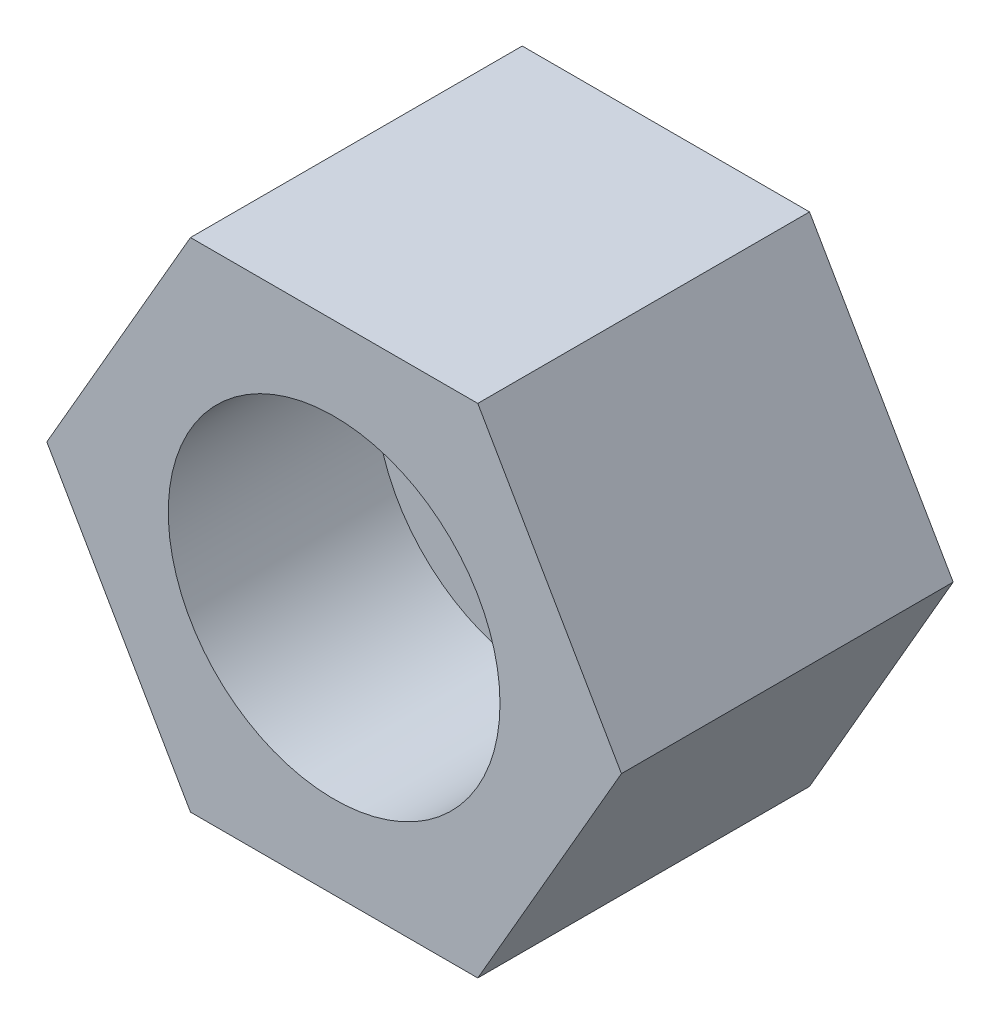
ISO-10303-21;
HEADER;
FILE_DESCRIPTION(('STEP AP214'),'2;1');
FILE_NAME('part.step','',(''),(''),'','','');
FILE_SCHEMA(('AUTOMOTIVE_DESIGN { 1 0 10303 214 1 1 1 1 }'));
ENDSEC;
DATA;
#1=APPLICATION_CONTEXT('core data for automotive mechanical design processes');
#2=APPLICATION_PROTOCOL_DEFINITION('international standard','automotive_design',2000,#1);
#3=PRODUCT_CONTEXT('',#1,'mechanical');
#4=PRODUCT('Part','Part','',(#3));
#5=PRODUCT_RELATED_PRODUCT_CATEGORY('part','',(#4));
#6=PRODUCT_DEFINITION_FORMATION('','',#4);
#7=PRODUCT_DEFINITION_CONTEXT('part definition',#1,'design');
#8=PRODUCT_DEFINITION('design','',#6,#7);
#9=PRODUCT_DEFINITION_SHAPE('','',#8);
#10=(LENGTH_UNIT() NAMED_UNIT(*) SI_UNIT(.MILLI.,.METRE.));
#11=(NAMED_UNIT(*) PLANE_ANGLE_UNIT() SI_UNIT($,.RADIAN.));
#12=(NAMED_UNIT(*) SI_UNIT($,.STERADIAN.) SOLID_ANGLE_UNIT());
#13=UNCERTAINTY_MEASURE_WITH_UNIT(LENGTH_MEASURE(1.E-05),#10,'distance_accuracy_value','');
#14=(GEOMETRIC_REPRESENTATION_CONTEXT(3) GLOBAL_UNCERTAINTY_ASSIGNED_CONTEXT((#13)) GLOBAL_UNIT_ASSIGNED_CONTEXT((#10,
#11,#12)) REPRESENTATION_CONTEXT('',''));
#15=CARTESIAN_POINT('',(0.,0.,0.));
#16=DIRECTION('',(0.,0.,1.));
#17=DIRECTION('',(1.,0.,0.));
#18=AXIS2_PLACEMENT_3D('',#15,#16,#17);
#19=CARTESIAN_POINT('',(0.,0.,4.));
#20=DIRECTION('',(0.,0.,-1.));
#21=DIRECTION('',(-1.,0.,0.));
#22=AXIS2_PLACEMENT_3D('',#19,#20,#21);
#23=CYLINDRICAL_SURFACE('',#22,2.5);
#24=CARTESIAN_POINT('',(0.,0.,-4.));
#25=DIRECTION('',(0.,0.,1.));
#26=DIRECTION('',(1.,0.,0.));
#27=AXIS2_PLACEMENT_3D('',#24,#25,#26);
#28=CIRCLE('',#27,2.5);
#29=CARTESIAN_POINT('',(2.5,0.,-4.));
#30=VERTEX_POINT('',#29);
#31=EDGE_CURVE('E126',#30,#30,#28,.T.);
#32=ORIENTED_EDGE('',*,*,#31,.F.);
#33=EDGE_LOOP('',(#32));
#34=FACE_BOUND('',#33,.T.);
#35=CARTESIAN_POINT('',(0.,0.,-1.));
#36=DIRECTION('',(0.,0.,1.));
#37=DIRECTION('',(1.,0.,0.));
#38=AXIS2_PLACEMENT_3D('',#35,#36,#37);
#39=CIRCLE('',#38,2.5);
#40=CARTESIAN_POINT('',(2.5,0.,-1.));
#41=VERTEX_POINT('',#40);
#42=EDGE_CURVE('E40',#41,#41,#39,.T.);
#43=ORIENTED_EDGE('',*,*,#42,.T.);
#44=EDGE_LOOP('',(#43));
#45=FACE_BOUND('',#44,.T.);
#46=ADVANCED_FACE('F36',(#34,#45),#23,.F.);
#47=CARTESIAN_POINT('',(0.,0.,4.));
#48=DIRECTION('',(0.,0.,1.));
#49=DIRECTION('',(1.,0.,0.));
#50=AXIS2_PLACEMENT_3D('',#47,#48,#49);
#51=PLANE('',#50);
#52=CARTESIAN_POINT('',(0.,0.,4.));
#53=DIRECTION('',(0.,0.,1.));
#54=DIRECTION('',(1.,0.,0.));
#55=AXIS2_PLACEMENT_3D('',#52,#53,#54);
#56=CIRCLE('',#55,4.);
#57=CARTESIAN_POINT('',(4.,0.,4.));
#58=VERTEX_POINT('',#57);
#59=EDGE_CURVE('E240',#58,#58,#56,.T.);
#60=ORIENTED_EDGE('',*,*,#59,.F.);
#61=EDGE_LOOP('',(#60));
#62=FACE_BOUND('',#61,.T.);
#63=DIRECTION('',(0.499999999999995,0.866025403784442,0.));
#64=VECTOR('',#63,1.);
#65=CARTESIAN_POINT('',(3.46410161513783,-5.99999999999996,4.));
#66=LINE('',#65,#64);
#67=CARTESIAN_POINT('',(3.46410161513783,-5.99999999999996,4.));
#68=VERTEX_POINT('',#67);
#69=CARTESIAN_POINT('',(6.92820323027551,0.,4.));
#70=VERTEX_POINT('',#69);
#71=EDGE_CURVE('E133',#68,#70,#66,.T.);
#72=ORIENTED_EDGE('',*,*,#71,.T.);
#73=DIRECTION('',(-0.500000000000001,0.866025403784438,0.));
#74=VECTOR('',#73,1.);
#75=CARTESIAN_POINT('',(6.92820323027551,0.,4.));
#76=LINE('',#75,#74);
#77=CARTESIAN_POINT('',(3.46410161513774,6.00000000000001,4.));
#78=VERTEX_POINT('',#77);
#79=EDGE_CURVE('E91',#70,#78,#76,.T.);
#80=ORIENTED_EDGE('',*,*,#79,.T.);
#81=DIRECTION('',(-1.,0.,0.));
#82=VECTOR('',#81,1.);
#83=CARTESIAN_POINT('',(3.46410161513774,6.00000000000001,4.));
#84=LINE('',#83,#82);
#85=CARTESIAN_POINT('',(-3.46410161513778,5.99999999999999,4.));
#86=VERTEX_POINT('',#85);
#87=EDGE_CURVE('E104',#78,#86,#84,.T.);
#88=ORIENTED_EDGE('',*,*,#87,.T.);
#89=DIRECTION('',(-0.499999999999995,-0.866025403784442,0.));
#90=VECTOR('',#89,1.);
#91=CARTESIAN_POINT('',(-3.46410161513778,5.99999999999999,4.));
#92=LINE('',#91,#90);
#93=CARTESIAN_POINT('',(-6.92820323027551,0.,4.));
#94=VERTEX_POINT('',#93);
#95=EDGE_CURVE('E98',#86,#94,#92,.T.);
#96=ORIENTED_EDGE('',*,*,#95,.T.);
#97=DIRECTION('',(0.500000000000007,-0.866025403784435,0.));
#98=VECTOR('',#97,1.);
#99=CARTESIAN_POINT('',(-6.92820323027551,0.,4.));
#100=LINE('',#99,#98);
#101=CARTESIAN_POINT('',(-3.4641016151377,-6.00000000000004,4.));
#102=VERTEX_POINT('',#101);
#103=EDGE_CURVE('E102',#94,#102,#100,.T.);
#104=ORIENTED_EDGE('',*,*,#103,.T.);
#105=DIRECTION('',(1.,0.,0.));
#106=VECTOR('',#105,1.);
#107=CARTESIAN_POINT('',(-3.4641016151377,-6.00000000000004,4.));
#108=LINE('',#107,#106);
#109=EDGE_CURVE('E54',#102,#68,#108,.T.);
#110=ORIENTED_EDGE('',*,*,#109,.T.);
#111=EDGE_LOOP('',(#72,#80,#88,#96,#104,#110));
#112=FACE_BOUND('',#111,.T.);
#113=ADVANCED_FACE('F100',(#62,#112),#51,.T.);
#114=CARTESIAN_POINT('',(0.,0.,-4.));
#115=DIRECTION('',(0.,0.,1.));
#116=DIRECTION('',(1.,0.,0.));
#117=AXIS2_PLACEMENT_3D('',#114,#115,#116);
#118=PLANE('',#117);
#119=DIRECTION('',(0.499999999999995,0.866025403784442,0.));
#120=VECTOR('',#119,1.);
#121=CARTESIAN_POINT('',(3.46410161513783,-5.99999999999996,-4.));
#122=LINE('',#121,#120);
#123=CARTESIAN_POINT('',(3.46410161513783,-5.99999999999996,-4.));
#124=VERTEX_POINT('',#123);
#125=CARTESIAN_POINT('',(6.92820323027551,0.,-4.));
#126=VERTEX_POINT('',#125);
#127=EDGE_CURVE('E122',#124,#126,#122,.T.);
#128=ORIENTED_EDGE('',*,*,#127,.F.);
#129=DIRECTION('',(1.,0.,0.));
#130=VECTOR('',#129,1.);
#131=CARTESIAN_POINT('',(-3.4641016151377,-6.00000000000004,-4.));
#132=LINE('',#131,#130);
#133=CARTESIAN_POINT('',(-3.4641016151377,-6.00000000000004,-4.));
#134=VERTEX_POINT('',#133);
#135=EDGE_CURVE('E83',#134,#124,#132,.T.);
#136=ORIENTED_EDGE('',*,*,#135,.F.);
#137=DIRECTION('',(0.500000000000007,-0.866025403784435,0.));
#138=VECTOR('',#137,1.);
#139=CARTESIAN_POINT('',(-6.92820323027551,0.,-4.));
#140=LINE('',#139,#138);
#141=CARTESIAN_POINT('',(-6.92820323027551,0.,-4.));
#142=VERTEX_POINT('',#141);
#143=EDGE_CURVE('E77',#142,#134,#140,.T.);
#144=ORIENTED_EDGE('',*,*,#143,.F.);
#145=DIRECTION('',(-0.499999999999995,-0.866025403784442,0.));
#146=VECTOR('',#145,1.);
#147=CARTESIAN_POINT('',(-3.46410161513778,5.99999999999999,-4.));
#148=LINE('',#147,#146);
#149=CARTESIAN_POINT('',(-3.46410161513778,5.99999999999999,-4.));
#150=VERTEX_POINT('',#149);
#151=EDGE_CURVE('E112',#150,#142,#148,.T.);
#152=ORIENTED_EDGE('',*,*,#151,.F.);
#153=DIRECTION('',(-1.,0.,0.));
#154=VECTOR('',#153,1.);
#155=CARTESIAN_POINT('',(3.46410161513774,6.00000000000001,-4.));
#156=LINE('',#155,#154);
#157=CARTESIAN_POINT('',(3.46410161513774,6.00000000000001,-4.));
#158=VERTEX_POINT('',#157);
#159=EDGE_CURVE('E128',#158,#150,#156,.T.);
#160=ORIENTED_EDGE('',*,*,#159,.F.);
#161=DIRECTION('',(-0.500000000000001,0.866025403784438,0.));
#162=VECTOR('',#161,1.);
#163=CARTESIAN_POINT('',(6.92820323027551,0.,-4.));
#164=LINE('',#163,#162);
#165=EDGE_CURVE('E125',#126,#158,#164,.T.);
#166=ORIENTED_EDGE('',*,*,#165,.F.);
#167=EDGE_LOOP('',(#128,#136,#144,#152,#160,#166));
#168=FACE_BOUND('',#167,.T.);
#169=ORIENTED_EDGE('',*,*,#31,.T.);
#170=EDGE_LOOP('',(#169));
#171=FACE_BOUND('',#170,.T.);
#172=ADVANCED_FACE('F143',(#168,#171),#118,.F.);
#173=CARTESIAN_POINT('',(3.46410161513783,-5.99999999999996,4.));
#174=DIRECTION('',(-0.866025403784442,0.499999999999995,0.));
#175=DIRECTION('',(-0.499999999999995,-0.866025403784442,0.));
#176=AXIS2_PLACEMENT_3D('',#173,#174,#175);
#177=PLANE('',#176);
#178=ORIENTED_EDGE('',*,*,#127,.T.);
#179=DIRECTION('',(0.,0.,-1.));
#180=VECTOR('',#179,1.);
#181=CARTESIAN_POINT('',(6.92820323027551,0.,4.));
#182=LINE('',#181,#180);
#183=EDGE_CURVE('E11',#70,#126,#182,.T.);
#184=ORIENTED_EDGE('',*,*,#183,.F.);
#185=ORIENTED_EDGE('',*,*,#71,.F.);
#186=DIRECTION('',(0.,0.,-1.));
#187=VECTOR('',#186,1.);
#188=CARTESIAN_POINT('',(3.46410161513783,-5.99999999999996,4.));
#189=LINE('',#188,#187);
#190=EDGE_CURVE('E118',#68,#124,#189,.T.);
#191=ORIENTED_EDGE('',*,*,#190,.T.);
#192=EDGE_LOOP('',(#178,#184,#185,#191));
#193=FACE_BOUND('',#192,.T.);
#194=ADVANCED_FACE('F38',(#193),#177,.F.);
#195=CARTESIAN_POINT('',(6.92820323027551,0.,4.));
#196=DIRECTION('',(-0.866025403784438,-0.500000000000001,0.));
#197=DIRECTION('',(0.500000000000001,-0.866025403784438,0.));
#198=AXIS2_PLACEMENT_3D('',#195,#196,#197);
#199=PLANE('',#198);
#200=ORIENTED_EDGE('',*,*,#165,.T.);
#201=DIRECTION('',(0.,0.,-1.));
#202=VECTOR('',#201,1.);
#203=CARTESIAN_POINT('',(3.46410161513774,6.00000000000001,4.));
#204=LINE('',#203,#202);
#205=EDGE_CURVE('E46',#78,#158,#204,.T.);
#206=ORIENTED_EDGE('',*,*,#205,.F.);
#207=ORIENTED_EDGE('',*,*,#79,.F.);
#208=ORIENTED_EDGE('',*,*,#183,.T.);
#209=EDGE_LOOP('',(#200,#206,#207,#208));
#210=FACE_BOUND('',#209,.T.);
#211=ADVANCED_FACE('F177',(#210),#199,.F.);
#212=CARTESIAN_POINT('',(3.46410161513774,6.00000000000001,4.));
#213=DIRECTION('',(0.,-1.,0.));
#214=DIRECTION('',(1.,0.,0.));
#215=AXIS2_PLACEMENT_3D('',#212,#213,#214);
#216=PLANE('',#215);
#217=ORIENTED_EDGE('',*,*,#159,.T.);
#218=DIRECTION('',(0.,0.,-1.));
#219=VECTOR('',#218,1.);
#220=CARTESIAN_POINT('',(-3.46410161513778,5.99999999999999,4.));
#221=LINE('',#220,#219);
#222=EDGE_CURVE('E113',#86,#150,#221,.T.);
#223=ORIENTED_EDGE('',*,*,#222,.F.);
#224=ORIENTED_EDGE('',*,*,#87,.F.);
#225=ORIENTED_EDGE('',*,*,#205,.T.);
#226=EDGE_LOOP('',(#217,#223,#224,#225));
#227=FACE_BOUND('',#226,.T.);
#228=ADVANCED_FACE('F140',(#227),#216,.F.);
#229=CARTESIAN_POINT('',(-3.46410161513778,5.99999999999999,4.));
#230=DIRECTION('',(0.866025403784442,-0.499999999999995,0.));
#231=DIRECTION('',(0.499999999999995,0.866025403784442,0.));
#232=AXIS2_PLACEMENT_3D('',#229,#230,#231);
#233=PLANE('',#232);
#234=ORIENTED_EDGE('',*,*,#151,.T.);
#235=DIRECTION('',(0.,0.,-1.));
#236=VECTOR('',#235,1.);
#237=CARTESIAN_POINT('',(-6.92820323027551,0.,4.));
#238=LINE('',#237,#236);
#239=EDGE_CURVE('E109',#94,#142,#238,.T.);
#240=ORIENTED_EDGE('',*,*,#239,.F.);
#241=ORIENTED_EDGE('',*,*,#95,.F.);
#242=ORIENTED_EDGE('',*,*,#222,.T.);
#243=EDGE_LOOP('',(#234,#240,#241,#242));
#244=FACE_BOUND('',#243,.T.);
#245=ADVANCED_FACE('F110',(#244),#233,.F.);
#246=CARTESIAN_POINT('',(-6.92820323027551,0.,4.));
#247=DIRECTION('',(0.866025403784435,0.500000000000007,0.));
#248=DIRECTION('',(-0.500000000000007,0.866025403784435,0.));
#249=AXIS2_PLACEMENT_3D('',#246,#247,#248);
#250=PLANE('',#249);
#251=ORIENTED_EDGE('',*,*,#143,.T.);
#252=DIRECTION('',(0.,0.,-1.));
#253=VECTOR('',#252,1.);
#254=CARTESIAN_POINT('',(-3.4641016151377,-6.00000000000004,4.));
#255=LINE('',#254,#253);
#256=EDGE_CURVE('E114',#102,#134,#255,.T.);
#257=ORIENTED_EDGE('',*,*,#256,.F.);
#258=ORIENTED_EDGE('',*,*,#103,.F.);
#259=ORIENTED_EDGE('',*,*,#239,.T.);
#260=EDGE_LOOP('',(#251,#257,#258,#259));
#261=FACE_BOUND('',#260,.T.);
#262=ADVANCED_FACE('F116',(#261),#250,.F.);
#263=CARTESIAN_POINT('',(-3.4641016151377,-6.00000000000004,4.));
#264=DIRECTION('',(0.,1.,0.));
#265=DIRECTION('',(-1.,0.,0.));
#266=AXIS2_PLACEMENT_3D('',#263,#264,#265);
#267=PLANE('',#266);
#268=ORIENTED_EDGE('',*,*,#135,.T.);
#269=ORIENTED_EDGE('',*,*,#190,.F.);
#270=ORIENTED_EDGE('',*,*,#109,.F.);
#271=ORIENTED_EDGE('',*,*,#256,.T.);
#272=EDGE_LOOP('',(#268,#269,#270,#271));
#273=FACE_BOUND('',#272,.T.);
#274=ADVANCED_FACE('F148',(#273),#267,.F.);
#275=CARTESIAN_POINT('',(0.,0.,-1.));
#276=DIRECTION('',(0.,0.,1.));
#277=DIRECTION('',(1.,0.,0.));
#278=AXIS2_PLACEMENT_3D('',#275,#276,#277);
#279=CYLINDRICAL_SURFACE('',#278,4.);
#280=CARTESIAN_POINT('',(0.,0.,-1.));
#281=DIRECTION('',(0.,0.,1.));
#282=DIRECTION('',(1.,0.,0.));
#283=AXIS2_PLACEMENT_3D('',#280,#281,#282);
#284=CIRCLE('',#283,4.);
#285=CARTESIAN_POINT('',(4.,0.,-1.));
#286=VERTEX_POINT('',#285);
#287=EDGE_CURVE('E239',#286,#286,#284,.T.);
#288=ORIENTED_EDGE('',*,*,#287,.F.);
#289=EDGE_LOOP('',(#288));
#290=FACE_BOUND('',#289,.T.);
#291=ORIENTED_EDGE('',*,*,#59,.T.);
#292=EDGE_LOOP('',(#291));
#293=FACE_BOUND('',#292,.T.);
#294=ADVANCED_FACE('F150',(#290,#293),#279,.F.);
#295=CARTESIAN_POINT('',(0.,0.,-1.));
#296=DIRECTION('',(0.,0.,1.));
#297=DIRECTION('',(1.,0.,0.));
#298=AXIS2_PLACEMENT_3D('',#295,#296,#297);
#299=PLANE('',#298);
#300=ORIENTED_EDGE('',*,*,#42,.F.);
#301=EDGE_LOOP('',(#300));
#302=FACE_BOUND('',#301,.T.);
#303=ORIENTED_EDGE('',*,*,#287,.T.);
#304=EDGE_LOOP('',(#303));
#305=FACE_BOUND('',#304,.T.);
#306=ADVANCED_FACE('F157',(#302,#305),#299,.T.);
#307=CLOSED_SHELL('',(#46,#113,#172,#194,#211,#228,#245,#262,#274,#294,#306));
#308=MANIFOLD_SOLID_BREP('B2',#307);
#309=ADVANCED_BREP_SHAPE_REPRESENTATION('',(#18,#308),#14);
#310=SHAPE_DEFINITION_REPRESENTATION(#9,#309);
ENDSEC;
END-ISO-10303-21;
